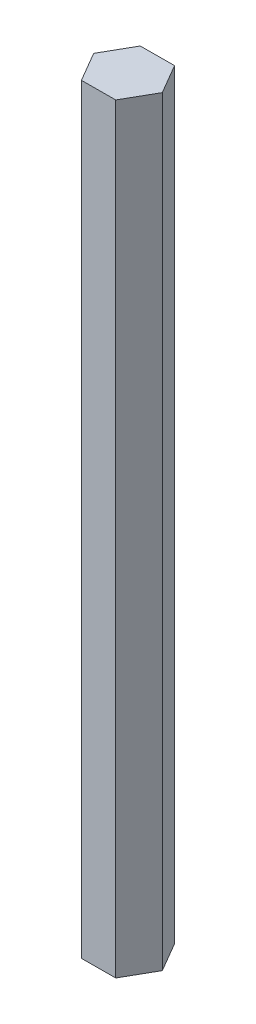
ISO-10303-21;
HEADER;
FILE_DESCRIPTION(('STEP AP214'),'2;1');
FILE_NAME('part.step','',(''),(''),'','','');
FILE_SCHEMA(('AUTOMOTIVE_DESIGN { 1 0 10303 214 1 1 1 1 }'));
ENDSEC;
DATA;
#1=APPLICATION_CONTEXT('core data for automotive mechanical design processes');
#2=APPLICATION_PROTOCOL_DEFINITION('international standard','automotive_design',2000,#1);
#3=PRODUCT_CONTEXT('',#1,'mechanical');
#4=PRODUCT('Part','Part','',(#3));
#5=PRODUCT_RELATED_PRODUCT_CATEGORY('part','',(#4));
#6=PRODUCT_DEFINITION_FORMATION('','',#4);
#7=PRODUCT_DEFINITION_CONTEXT('part definition',#1,'design');
#8=PRODUCT_DEFINITION('design','',#6,#7);
#9=PRODUCT_DEFINITION_SHAPE('','',#8);
#10=(LENGTH_UNIT() NAMED_UNIT(*) SI_UNIT(.MILLI.,.METRE.));
#11=(NAMED_UNIT(*) PLANE_ANGLE_UNIT() SI_UNIT($,.RADIAN.));
#12=(NAMED_UNIT(*) SI_UNIT($,.STERADIAN.) SOLID_ANGLE_UNIT());
#13=UNCERTAINTY_MEASURE_WITH_UNIT(LENGTH_MEASURE(1.E-05),#10,'distance_accuracy_value','');
#14=(GEOMETRIC_REPRESENTATION_CONTEXT(3) GLOBAL_UNCERTAINTY_ASSIGNED_CONTEXT((#13)) GLOBAL_UNIT_ASSIGNED_CONTEXT((#10,
#11,#12)) REPRESENTATION_CONTEXT('',''));
#15=CARTESIAN_POINT('',(0.,0.,0.));
#16=DIRECTION('',(0.,0.,1.));
#17=DIRECTION('',(1.,0.,0.));
#18=AXIS2_PLACEMENT_3D('',#15,#16,#17);
#19=CARTESIAN_POINT('',(-7.33224565315824,116.,0.0388202920563353));
#20=DIRECTION('',(0.863366072490886,0.,-0.504578066181698));
#21=DIRECTION('',(-0.504578066181698,0.,-0.863366072490886));
#22=AXIS2_PLACEMENT_3D('',#19,#20,#21);
#23=PLANE('',#22);
#24=DIRECTION('',(0.,-1.,0.));
#25=VECTOR('',#24,1.);
#26=CARTESIAN_POINT('',(-7.33224565315824,116.,0.0388202920563353));
#27=LINE('',#26,#25);
#28=CARTESIAN_POINT('',(-7.33224565315824,116.,0.0388202920563353));
#29=VERTEX_POINT('',#28);
#30=CARTESIAN_POINT('',(-7.33224565315824,-47.28,0.0388202920562769));
#31=VERTEX_POINT('',#30);
#32=EDGE_CURVE('E154',#29,#31,#27,.T.);
#33=ORIENTED_EDGE('',*,*,#32,.T.);
#34=DIRECTION('',(-0.504578066181691,0.,-0.86336607249089));
#35=VECTOR('',#34,1.);
#36=CARTESIAN_POINT('',(-3.63250346747605,-47.28,6.3693211484512));
#37=LINE('',#36,#35);
#38=CARTESIAN_POINT('',(-3.63250346747605,-47.28,6.3693211484512));
#39=VERTEX_POINT('',#38);
#40=EDGE_CURVE('E130',#39,#31,#37,.T.);
#41=ORIENTED_EDGE('',*,*,#40,.F.);
#42=DIRECTION('',(0.,-1.,0.));
#43=VECTOR('',#42,1.);
#44=CARTESIAN_POINT('',(-3.632503467476,116.,6.36932114845123));
#45=LINE('',#44,#43);
#46=CARTESIAN_POINT('',(-3.632503467476,116.,6.36932114845123));
#47=VERTEX_POINT('',#46);
#48=EDGE_CURVE('E11',#47,#39,#45,.T.);
#49=ORIENTED_EDGE('',*,*,#48,.F.);
#50=DIRECTION('',(0.504578066181698,0.,0.863366072490886));
#51=VECTOR('',#50,1.);
#52=CARTESIAN_POINT('',(-7.33224565315824,116.,0.0388202920563353));
#53=LINE('',#52,#51);
#54=EDGE_CURVE('E139',#29,#47,#53,.T.);
#55=ORIENTED_EDGE('',*,*,#54,.F.);
#56=EDGE_LOOP('',(#33,#41,#49,#55));
#57=FACE_BOUND('',#56,.T.);
#58=ADVANCED_FACE('F45',(#57),#23,.F.);
#59=CARTESIAN_POINT('',(-3.632503467476,116.,6.36932114845123));
#60=DIRECTION('',(-0.00529438726033345,0.,-0.999985984633553));
#61=DIRECTION('',(-0.999985984633554,0.,0.00529438726033345));
#62=AXIS2_PLACEMENT_3D('',#59,#60,#61);
#63=PLANE('',#62);
#64=ORIENTED_EDGE('',*,*,#48,.T.);
#65=DIRECTION('',(-0.999985984633553,0.,0.00529438726032553));
#66=VECTOR('',#65,1.);
#67=CARTESIAN_POINT('',(3.69974218568218,-47.28,6.33050085639492));
#68=LINE('',#67,#66);
#69=CARTESIAN_POINT('',(3.69974218568218,-47.28,6.33050085639492));
#70=VERTEX_POINT('',#69);
#71=EDGE_CURVE('E118',#70,#39,#68,.T.);
#72=ORIENTED_EDGE('',*,*,#71,.F.);
#73=DIRECTION('',(0.,-1.,0.));
#74=VECTOR('',#73,1.);
#75=CARTESIAN_POINT('',(3.69974218568224,116.,6.3305008563949));
#76=LINE('',#75,#74);
#77=CARTESIAN_POINT('',(3.69974218568224,116.,6.3305008563949));
#78=VERTEX_POINT('',#77);
#79=EDGE_CURVE('E53',#78,#70,#76,.T.);
#80=ORIENTED_EDGE('',*,*,#79,.F.);
#81=DIRECTION('',(0.999985984633554,0.,-0.00529438726033345));
#82=VECTOR('',#81,1.);
#83=CARTESIAN_POINT('',(-3.632503467476,116.,6.36932114845123));
#84=LINE('',#83,#82);
#85=EDGE_CURVE('E142',#47,#78,#84,.T.);
#86=ORIENTED_EDGE('',*,*,#85,.F.);
#87=EDGE_LOOP('',(#64,#72,#80,#86));
#88=FACE_BOUND('',#87,.T.);
#89=ADVANCED_FACE('F173',(#88),#63,.F.);
#90=CARTESIAN_POINT('',(3.69974218568224,116.,6.3305008563949));
#91=DIRECTION('',(-0.86866045975122,0.,-0.495407918451855));
#92=DIRECTION('',(-0.495407918451855,0.,0.86866045975122));
#93=AXIS2_PLACEMENT_3D('',#90,#91,#92);
#94=PLANE('',#93);
#95=ORIENTED_EDGE('',*,*,#79,.T.);
#96=DIRECTION('',(-0.495407918451862,0.,0.868660459751216));
#97=VECTOR('',#96,1.);
#98=CARTESIAN_POINT('',(7.33224565315823,-47.28,-0.0388202920562743));
#99=LINE('',#98,#97);
#100=CARTESIAN_POINT('',(7.33224565315823,-47.28,-0.0388202920562743));
#101=VERTEX_POINT('',#100);
#102=EDGE_CURVE('E111',#101,#70,#99,.T.);
#103=ORIENTED_EDGE('',*,*,#102,.F.);
#104=DIRECTION('',(0.,-1.,0.));
#105=VECTOR('',#104,1.);
#106=CARTESIAN_POINT('',(7.33224565315824,116.,-0.0388202920563362));
#107=LINE('',#106,#105);
#108=CARTESIAN_POINT('',(7.33224565315824,116.,-0.0388202920563362));
#109=VERTEX_POINT('',#108);
#110=EDGE_CURVE('E98',#109,#101,#107,.T.);
#111=ORIENTED_EDGE('',*,*,#110,.F.);
#112=DIRECTION('',(0.495407918451855,0.,-0.868660459751219));
#113=VECTOR('',#112,1.);
#114=CARTESIAN_POINT('',(3.69974218568224,116.,6.3305008563949));
#115=LINE('',#114,#113);
#116=EDGE_CURVE('E145',#78,#109,#115,.T.);
#117=ORIENTED_EDGE('',*,*,#116,.F.);
#118=EDGE_LOOP('',(#95,#103,#111,#117));
#119=FACE_BOUND('',#118,.T.);
#120=ADVANCED_FACE('F112',(#119),#94,.F.);
#121=CARTESIAN_POINT('',(7.33224565315824,116.,-0.0388202920563362));
#122=DIRECTION('',(-0.863366072490886,0.,0.504578066181698));
#123=DIRECTION('',(0.504578066181699,0.,0.863366072490886));
#124=AXIS2_PLACEMENT_3D('',#121,#122,#123);
#125=PLANE('',#124);
#126=ORIENTED_EDGE('',*,*,#110,.T.);
#127=DIRECTION('',(0.504578066181691,0.,0.86336607249089));
#128=VECTOR('',#127,1.);
#129=CARTESIAN_POINT('',(3.63250346747605,-47.28,-6.36932114845119));
#130=LINE('',#129,#128);
#131=CARTESIAN_POINT('',(3.63250346747605,-47.28,-6.36932114845119));
#132=VERTEX_POINT('',#131);
#133=EDGE_CURVE('E103',#132,#101,#130,.T.);
#134=ORIENTED_EDGE('',*,*,#133,.F.);
#135=DIRECTION('',(0.,-1.,0.));
#136=VECTOR('',#135,1.);
#137=CARTESIAN_POINT('',(3.632503467476,116.,-6.36932114845123));
#138=LINE('',#137,#136);
#139=CARTESIAN_POINT('',(3.632503467476,116.,-6.36932114845123));
#140=VERTEX_POINT('',#139);
#141=EDGE_CURVE('E108',#140,#132,#138,.T.);
#142=ORIENTED_EDGE('',*,*,#141,.F.);
#143=DIRECTION('',(-0.504578066181698,0.,-0.863366072490886));
#144=VECTOR('',#143,1.);
#145=CARTESIAN_POINT('',(7.33224565315824,116.,-0.0388202920563362));
#146=LINE('',#145,#144);
#147=EDGE_CURVE('E104',#109,#140,#146,.T.);
#148=ORIENTED_EDGE('',*,*,#147,.F.);
#149=EDGE_LOOP('',(#126,#134,#142,#148));
#150=FACE_BOUND('',#149,.T.);
#151=ADVANCED_FACE('F100',(#150),#125,.F.);
#152=CARTESIAN_POINT('',(3.632503467476,116.,-6.36932114845123));
#153=DIRECTION('',(0.00529438726033345,0.,0.999985984633554));
#154=DIRECTION('',(0.999985984633554,0.,-0.00529438726033345));
#155=AXIS2_PLACEMENT_3D('',#152,#153,#154);
#156=PLANE('',#155);
#157=ORIENTED_EDGE('',*,*,#141,.T.);
#158=DIRECTION('',(0.999985984633554,0.,-0.00529438726032505));
#159=VECTOR('',#158,1.);
#160=CARTESIAN_POINT('',(-3.69974218568219,-47.28,-6.33050085639492));
#161=LINE('',#160,#159);
#162=CARTESIAN_POINT('',(-3.69974218568219,-47.28,-6.33050085639492));
#163=VERTEX_POINT('',#162);
#164=EDGE_CURVE('E124',#163,#132,#161,.T.);
#165=ORIENTED_EDGE('',*,*,#164,.F.);
#166=DIRECTION('',(0.,-1.,0.));
#167=VECTOR('',#166,1.);
#168=CARTESIAN_POINT('',(-3.69974218568224,116.,-6.3305008563949));
#169=LINE('',#168,#167);
#170=CARTESIAN_POINT('',(-3.69974218568224,116.,-6.3305008563949));
#171=VERTEX_POINT('',#170);
#172=EDGE_CURVE('E157',#171,#163,#169,.T.);
#173=ORIENTED_EDGE('',*,*,#172,.F.);
#174=DIRECTION('',(-0.999985984633553,0.,0.00529438726033345));
#175=VECTOR('',#174,1.);
#176=CARTESIAN_POINT('',(3.632503467476,116.,-6.36932114845123));
#177=LINE('',#176,#175);
#178=EDGE_CURVE('E65',#140,#171,#177,.T.);
#179=ORIENTED_EDGE('',*,*,#178,.F.);
#180=EDGE_LOOP('',(#157,#165,#173,#179));
#181=FACE_BOUND('',#180,.T.);
#182=ADVANCED_FACE('F163',(#181),#156,.F.);
#183=CARTESIAN_POINT('',(-3.69974218568224,116.,-6.3305008563949));
#184=DIRECTION('',(0.868660459751219,0.,0.495407918451855));
#185=DIRECTION('',(0.495407918451855,0.,-0.86866045975122));
#186=AXIS2_PLACEMENT_3D('',#183,#184,#185);
#187=PLANE('',#186);
#188=ORIENTED_EDGE('',*,*,#172,.T.);
#189=DIRECTION('',(0.495407918451862,0.,-0.868660459751216));
#190=VECTOR('',#189,1.);
#191=CARTESIAN_POINT('',(-7.33224565315824,-47.28,0.0388202920562769));
#192=LINE('',#191,#190);
#193=EDGE_CURVE('E134',#31,#163,#192,.T.);
#194=ORIENTED_EDGE('',*,*,#193,.F.);
#195=ORIENTED_EDGE('',*,*,#32,.F.);
#196=DIRECTION('',(-0.495407918451855,0.,0.86866045975122));
#197=VECTOR('',#196,1.);
#198=CARTESIAN_POINT('',(-3.69974218568224,116.,-6.3305008563949));
#199=LINE('',#198,#197);
#200=EDGE_CURVE('E60',#171,#29,#199,.T.);
#201=ORIENTED_EDGE('',*,*,#200,.F.);
#202=EDGE_LOOP('',(#188,#194,#195,#201));
#203=FACE_BOUND('',#202,.T.);
#204=ADVANCED_FACE('F166',(#203),#187,.F.);
#205=CARTESIAN_POINT('',(0.,116.,0.));
#206=DIRECTION('',(0.,1.,0.));
#207=DIRECTION('',(0.,0.,1.));
#208=AXIS2_PLACEMENT_3D('',#205,#206,#207);
#209=PLANE('',#208);
#210=ORIENTED_EDGE('',*,*,#54,.T.);
#211=ORIENTED_EDGE('',*,*,#85,.T.);
#212=ORIENTED_EDGE('',*,*,#116,.T.);
#213=ORIENTED_EDGE('',*,*,#147,.T.);
#214=ORIENTED_EDGE('',*,*,#178,.T.);
#215=ORIENTED_EDGE('',*,*,#200,.T.);
#216=EDGE_LOOP('',(#210,#211,#212,#213,#214,#215));
#217=FACE_BOUND('',#216,.T.);
#218=ADVANCED_FACE('F171',(#217),#209,.T.);
#219=CARTESIAN_POINT('',(0.,-47.28,0.));
#220=DIRECTION('',(0.,-1.,0.));
#221=DIRECTION('',(0.,0.,-1.));
#222=AXIS2_PLACEMENT_3D('',#219,#220,#221);
#223=PLANE('',#222);
#224=ORIENTED_EDGE('',*,*,#133,.T.);
#225=ORIENTED_EDGE('',*,*,#102,.T.);
#226=ORIENTED_EDGE('',*,*,#71,.T.);
#227=ORIENTED_EDGE('',*,*,#40,.T.);
#228=ORIENTED_EDGE('',*,*,#193,.T.);
#229=ORIENTED_EDGE('',*,*,#164,.T.);
#230=EDGE_LOOP('',(#224,#225,#226,#227,#228,#229));
#231=FACE_BOUND('',#230,.T.);
#232=ADVANCED_FACE('F121',(#231),#223,.T.);
#233=CLOSED_SHELL('',(#58,#89,#120,#151,#182,#204,#218,#232));
#234=MANIFOLD_SOLID_BREP('B2',#233);
#235=ADVANCED_BREP_SHAPE_REPRESENTATION('',(#18,#234),#14);
#236=SHAPE_DEFINITION_REPRESENTATION(#9,#235);
ENDSEC;
END-ISO-10303-21;
